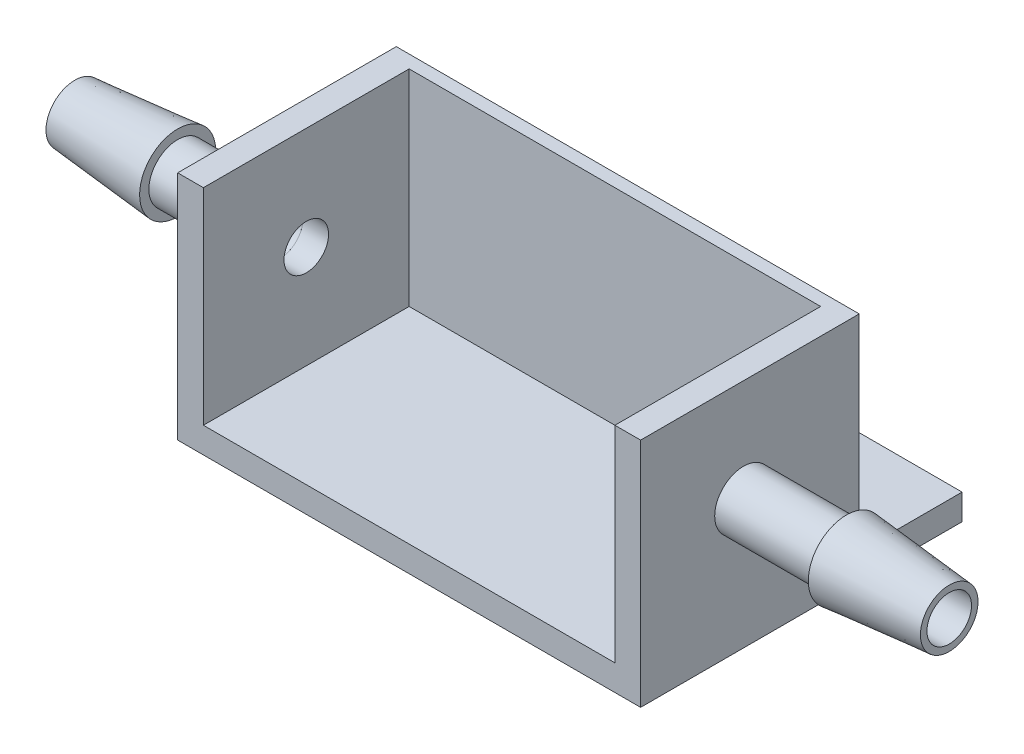
ISO-10303-21;
HEADER;
FILE_DESCRIPTION(('STEP AP214'),'2;1');
FILE_NAME('part.step','',(''),(''),'','','');
FILE_SCHEMA(('AUTOMOTIVE_DESIGN { 1 0 10303 214 1 1 1 1 }'));
ENDSEC;
DATA;
#1=APPLICATION_CONTEXT('core data for automotive mechanical design processes');
#2=APPLICATION_PROTOCOL_DEFINITION('international standard','automotive_design',2000,#1);
#3=PRODUCT_CONTEXT('',#1,'mechanical');
#4=PRODUCT('Part','Part','',(#3));
#5=PRODUCT_RELATED_PRODUCT_CATEGORY('part','',(#4));
#6=PRODUCT_DEFINITION_FORMATION('','',#4);
#7=PRODUCT_DEFINITION_CONTEXT('part definition',#1,'design');
#8=PRODUCT_DEFINITION('design','',#6,#7);
#9=PRODUCT_DEFINITION_SHAPE('','',#8);
#10=(LENGTH_UNIT() NAMED_UNIT(*) SI_UNIT(.MILLI.,.METRE.));
#11=(NAMED_UNIT(*) PLANE_ANGLE_UNIT() SI_UNIT($,.RADIAN.));
#12=(NAMED_UNIT(*) SI_UNIT($,.STERADIAN.) SOLID_ANGLE_UNIT());
#13=UNCERTAINTY_MEASURE_WITH_UNIT(LENGTH_MEASURE(1.E-05),#10,'distance_accuracy_value','');
#14=(GEOMETRIC_REPRESENTATION_CONTEXT(3) GLOBAL_UNCERTAINTY_ASSIGNED_CONTEXT((#13)) GLOBAL_UNIT_ASSIGNED_CONTEXT((#10,
#11,#12)) REPRESENTATION_CONTEXT('',''));
#15=CARTESIAN_POINT('',(0.,0.,0.));
#16=DIRECTION('',(0.,0.,1.));
#17=DIRECTION('',(1.,0.,0.));
#18=AXIS2_PLACEMENT_3D('',#15,#16,#17);
#19=CARTESIAN_POINT('',(57.15,35.687,0.));
#20=DIRECTION('',(1.,0.,0.));
#21=DIRECTION('',(0.,0.,-1.));
#22=AXIS2_PLACEMENT_3D('',#19,#20,#21);
#23=PLANE('',#22);
#24=CARTESIAN_POINT('',(57.15,31.75,0.));
#25=DIRECTION('',(1.,0.,0.));
#26=DIRECTION('',(0.,0.,-1.));
#27=AXIS2_PLACEMENT_3D('',#24,#25,#26);
#28=CIRCLE('',#27,5.5);
#29=CARTESIAN_POINT('',(57.15,31.75,-5.5));
#30=VERTEX_POINT('',#29);
#31=EDGE_CURVE('E61',#30,#30,#28,.T.);
#32=ORIENTED_EDGE('',*,*,#31,.T.);
#33=EDGE_LOOP('',(#32));
#34=FACE_BOUND('',#33,.T.);
#35=CARTESIAN_POINT('',(57.15,31.75,0.));
#36=DIRECTION('',(-1.,0.,0.));
#37=DIRECTION('',(0.,0.,1.));
#38=AXIS2_PLACEMENT_3D('',#35,#36,#37);
#39=CIRCLE('',#38,7.11200000000003);
#40=CARTESIAN_POINT('',(57.15,31.75,7.11200000000003));
#41=VERTEX_POINT('',#40);
#42=EDGE_CURVE('E11',#41,#41,#39,.T.);
#43=ORIENTED_EDGE('',*,*,#42,.T.);
#44=EDGE_LOOP('',(#43));
#45=FACE_BOUND('',#44,.T.);
#46=ADVANCED_FACE('F42',(#34,#45),#23,.F.);
#47=CARTESIAN_POINT('',(-76.2,31.75,0.));
#48=DIRECTION('',(-1.,0.,0.));
#49=DIRECTION('',(0.,0.,1.));
#50=AXIS2_PLACEMENT_3D('',#47,#48,#49);
#51=CYLINDRICAL_SURFACE('',#50,7.11200000000003);
#52=ORIENTED_EDGE('',*,*,#42,.F.);
#53=EDGE_LOOP('',(#52));
#54=FACE_BOUND('',#53,.T.);
#55=CARTESIAN_POINT('',(82.55,31.75,0.));
#56=DIRECTION('',(-1.,0.,0.));
#57=DIRECTION('',(0.,0.,1.));
#58=AXIS2_PLACEMENT_3D('',#55,#56,#57);
#59=CIRCLE('',#58,7.11200000000003);
#60=CARTESIAN_POINT('',(82.55,31.75,7.11200000000003));
#61=VERTEX_POINT('',#60);
#62=EDGE_CURVE('E48',#61,#61,#59,.T.);
#63=ORIENTED_EDGE('',*,*,#62,.T.);
#64=EDGE_LOOP('',(#63));
#65=FACE_BOUND('',#64,.T.);
#66=ADVANCED_FACE('F85',(#54,#65),#51,.T.);
#67=CARTESIAN_POINT('',(82.55,38.862,0.));
#68=DIRECTION('',(1.,0.,0.));
#69=DIRECTION('',(0.,0.,-1.));
#70=AXIS2_PLACEMENT_3D('',#67,#68,#69);
#71=PLANE('',#70);
#72=ORIENTED_EDGE('',*,*,#62,.F.);
#73=EDGE_LOOP('',(#72));
#74=FACE_BOUND('',#73,.T.);
#75=CARTESIAN_POINT('',(82.55,31.75,0.));
#76=DIRECTION('',(-1.,0.,0.));
#77=DIRECTION('',(0.,0.,1.));
#78=AXIS2_PLACEMENT_3D('',#75,#76,#77);
#79=CIRCLE('',#78,9.39800000000002);
#80=CARTESIAN_POINT('',(82.55,31.75,9.39800000000002));
#81=VERTEX_POINT('',#80);
#82=EDGE_CURVE('E52',#81,#81,#79,.T.);
#83=ORIENTED_EDGE('',*,*,#82,.T.);
#84=EDGE_LOOP('',(#83));
#85=FACE_BOUND('',#84,.T.);
#86=ADVANCED_FACE('F79',(#74,#85),#71,.F.);
#87=CARTESIAN_POINT('',(107.95,31.75,0.));
#88=DIRECTION('',(-1.,0.,0.));
#89=DIRECTION('',(0.,0.,1.));
#90=AXIS2_PLACEMENT_3D('',#87,#88,#89);
#91=CONICAL_SURFACE('',#90,7.11200000000004,0.0897581741899497);
#92=ORIENTED_EDGE('',*,*,#82,.F.);
#93=EDGE_LOOP('',(#92));
#94=FACE_BOUND('',#93,.T.);
#95=CARTESIAN_POINT('',(107.95,31.75,0.));
#96=DIRECTION('',(-1.,0.,0.));
#97=DIRECTION('',(0.,0.,1.));
#98=AXIS2_PLACEMENT_3D('',#95,#96,#97);
#99=CIRCLE('',#98,7.11200000000004);
#100=CARTESIAN_POINT('',(107.95,31.75,7.11200000000004));
#101=VERTEX_POINT('',#100);
#102=EDGE_CURVE('E56',#101,#101,#99,.T.);
#103=ORIENTED_EDGE('',*,*,#102,.T.);
#104=EDGE_LOOP('',(#103));
#105=FACE_BOUND('',#104,.T.);
#106=ADVANCED_FACE('F74',(#94,#105),#91,.T.);
#107=CARTESIAN_POINT('',(107.95,38.862,0.));
#108=DIRECTION('',(-1.,0.,0.));
#109=DIRECTION('',(0.,0.,1.));
#110=AXIS2_PLACEMENT_3D('',#107,#108,#109);
#111=PLANE('',#110);
#112=CARTESIAN_POINT('',(107.95,31.75,0.));
#113=DIRECTION('',(1.,0.,0.));
#114=DIRECTION('',(0.,0.,-1.));
#115=AXIS2_PLACEMENT_3D('',#112,#113,#114);
#116=CIRCLE('',#115,5.5);
#117=CARTESIAN_POINT('',(107.95,31.75,-5.5));
#118=VERTEX_POINT('',#117);
#119=EDGE_CURVE('E64',#118,#118,#116,.T.);
#120=ORIENTED_EDGE('',*,*,#119,.F.);
#121=EDGE_LOOP('',(#120));
#122=FACE_BOUND('',#121,.T.);
#123=ORIENTED_EDGE('',*,*,#102,.F.);
#124=EDGE_LOOP('',(#123));
#125=FACE_BOUND('',#124,.T.);
#126=ADVANCED_FACE('F71',(#122,#125),#111,.F.);
#127=CARTESIAN_POINT('',(-107.95,31.75,0.));
#128=DIRECTION('',(1.,0.,0.));
#129=DIRECTION('',(0.,0.,-1.));
#130=AXIS2_PLACEMENT_3D('',#127,#128,#129);
#131=CYLINDRICAL_SURFACE('',#130,5.5);
#132=ORIENTED_EDGE('',*,*,#119,.T.);
#133=EDGE_LOOP('',(#132));
#134=FACE_BOUND('',#133,.T.);
#135=ORIENTED_EDGE('',*,*,#31,.F.);
#136=EDGE_LOOP('',(#135));
#137=FACE_BOUND('',#136,.T.);
#138=ADVANCED_FACE('F68',(#134,#137),#131,.F.);
#139=CLOSED_SHELL('',(#46,#66,#86,#106,#126,#138));
#140=MANIFOLD_SOLID_BREP('B2',#139);
#141=CARTESIAN_POINT('',(-76.2,31.75,0.));
#142=DIRECTION('',(-1.,0.,0.));
#143=DIRECTION('',(0.,0.,1.));
#144=AXIS2_PLACEMENT_3D('',#141,#142,#143);
#145=CYLINDRICAL_SURFACE('',#144,7.11200000000001);
#146=CARTESIAN_POINT('',(-82.55,31.75,0.));
#147=DIRECTION('',(-1.,0.,0.));
#148=DIRECTION('',(0.,0.,1.));
#149=AXIS2_PLACEMENT_3D('',#146,#147,#148);
#150=CIRCLE('',#149,7.11200000000001);
#151=CARTESIAN_POINT('',(-82.55,31.75,7.11200000000001));
#152=VERTEX_POINT('',#151);
#153=EDGE_CURVE('E150',#152,#152,#150,.T.);
#154=ORIENTED_EDGE('',*,*,#153,.F.);
#155=EDGE_LOOP('',(#154));
#156=FACE_BOUND('',#155,.T.);
#157=CARTESIAN_POINT('',(-57.15,31.75,0.));
#158=DIRECTION('',(-1.,0.,0.));
#159=DIRECTION('',(0.,0.,1.));
#160=AXIS2_PLACEMENT_3D('',#157,#158,#159);
#161=CIRCLE('',#160,7.11200000000001);
#162=CARTESIAN_POINT('',(-57.15,31.75,7.11200000000001));
#163=VERTEX_POINT('',#162);
#164=EDGE_CURVE('E41',#163,#163,#161,.T.);
#165=ORIENTED_EDGE('',*,*,#164,.T.);
#166=EDGE_LOOP('',(#165));
#167=FACE_BOUND('',#166,.T.);
#168=ADVANCED_FACE('F143',(#156,#167),#145,.T.);
#169=CARTESIAN_POINT('',(-82.55,38.862,0.));
#170=DIRECTION('',(-1.,0.,0.));
#171=DIRECTION('',(0.,0.,1.));
#172=AXIS2_PLACEMENT_3D('',#169,#170,#171);
#173=PLANE('',#172);
#174=CARTESIAN_POINT('',(-82.55,31.75,0.));
#175=DIRECTION('',(-1.,0.,0.));
#176=DIRECTION('',(0.,0.,1.));
#177=AXIS2_PLACEMENT_3D('',#174,#175,#176);
#178=CIRCLE('',#177,9.398);
#179=CARTESIAN_POINT('',(-82.55,31.75,9.398));
#180=VERTEX_POINT('',#179);
#181=EDGE_CURVE('E154',#180,#180,#178,.T.);
#182=ORIENTED_EDGE('',*,*,#181,.F.);
#183=EDGE_LOOP('',(#182));
#184=FACE_BOUND('',#183,.T.);
#185=ORIENTED_EDGE('',*,*,#153,.T.);
#186=EDGE_LOOP('',(#185));
#187=FACE_BOUND('',#186,.T.);
#188=ADVANCED_FACE('F182',(#184,#187),#173,.F.);
#189=CARTESIAN_POINT('',(-82.55,31.75,0.));
#190=DIRECTION('',(1.,0.,0.));
#191=DIRECTION('',(0.,0.,-1.));
#192=AXIS2_PLACEMENT_3D('',#189,#190,#191);
#193=CONICAL_SURFACE('',#192,9.398,0.0897581741899501);
#194=CARTESIAN_POINT('',(-107.95,31.75,0.));
#195=DIRECTION('',(-1.,0.,0.));
#196=DIRECTION('',(0.,0.,1.));
#197=AXIS2_PLACEMENT_3D('',#194,#195,#196);
#198=CIRCLE('',#197,7.11200000000001);
#199=CARTESIAN_POINT('',(-107.95,31.75,7.11200000000001));
#200=VERTEX_POINT('',#199);
#201=EDGE_CURVE('E159',#200,#200,#198,.T.);
#202=ORIENTED_EDGE('',*,*,#201,.F.);
#203=EDGE_LOOP('',(#202));
#204=FACE_BOUND('',#203,.T.);
#205=ORIENTED_EDGE('',*,*,#181,.T.);
#206=EDGE_LOOP('',(#205));
#207=FACE_BOUND('',#206,.T.);
#208=ADVANCED_FACE('F187',(#204,#207),#193,.T.);
#209=CARTESIAN_POINT('',(-107.95,35.687,0.));
#210=DIRECTION('',(1.,0.,0.));
#211=DIRECTION('',(0.,0.,-1.));
#212=AXIS2_PLACEMENT_3D('',#209,#210,#211);
#213=PLANE('',#212);
#214=CARTESIAN_POINT('',(-107.95,31.75,0.));
#215=DIRECTION('',(1.,0.,0.));
#216=DIRECTION('',(0.,0.,-1.));
#217=AXIS2_PLACEMENT_3D('',#214,#215,#216);
#218=CIRCLE('',#217,5.5);
#219=CARTESIAN_POINT('',(-107.95,31.75,-5.5));
#220=VERTEX_POINT('',#219);
#221=EDGE_CURVE('E162',#220,#220,#218,.T.);
#222=ORIENTED_EDGE('',*,*,#221,.T.);
#223=EDGE_LOOP('',(#222));
#224=FACE_BOUND('',#223,.T.);
#225=ORIENTED_EDGE('',*,*,#201,.T.);
#226=EDGE_LOOP('',(#225));
#227=FACE_BOUND('',#226,.T.);
#228=ADVANCED_FACE('F179',(#224,#227),#213,.F.);
#229=CARTESIAN_POINT('',(-57.15,31.75,0.));
#230=DIRECTION('',(-1.,0.,0.));
#231=DIRECTION('',(0.,0.,1.));
#232=AXIS2_PLACEMENT_3D('',#229,#230,#231);
#233=PLANE('',#232);
#234=CARTESIAN_POINT('',(-57.15,31.75,0.));
#235=DIRECTION('',(-1.,0.,0.));
#236=DIRECTION('',(0.,0.,1.));
#237=AXIS2_PLACEMENT_3D('',#234,#235,#236);
#238=CIRCLE('',#237,5.5);
#239=CARTESIAN_POINT('',(-57.15,31.75,5.5));
#240=VERTEX_POINT('',#239);
#241=EDGE_CURVE('E146',#240,#240,#238,.T.);
#242=ORIENTED_EDGE('',*,*,#241,.T.);
#243=EDGE_LOOP('',(#242));
#244=FACE_BOUND('',#243,.T.);
#245=ORIENTED_EDGE('',*,*,#164,.F.);
#246=EDGE_LOOP('',(#245));
#247=FACE_BOUND('',#246,.T.);
#248=ADVANCED_FACE('F169',(#244,#247),#233,.F.);
#249=CARTESIAN_POINT('',(-107.95,31.75,0.));
#250=DIRECTION('',(1.,0.,0.));
#251=DIRECTION('',(0.,0.,-1.));
#252=AXIS2_PLACEMENT_3D('',#249,#250,#251);
#253=CYLINDRICAL_SURFACE('',#252,5.5);
#254=ORIENTED_EDGE('',*,*,#221,.F.);
#255=EDGE_LOOP('',(#254));
#256=FACE_BOUND('',#255,.T.);
#257=ORIENTED_EDGE('',*,*,#241,.F.);
#258=EDGE_LOOP('',(#257));
#259=FACE_BOUND('',#258,.T.);
#260=ADVANCED_FACE('F172',(#256,#259),#253,.F.);
#261=CLOSED_SHELL('',(#168,#188,#208,#228,#248,#260));
#262=MANIFOLD_SOLID_BREP('B6',#261);
#263=CARTESIAN_POINT('',(0.,0.,-28.575));
#264=DIRECTION('',(0.,0.,-1.));
#265=DIRECTION('',(-1.,0.,0.));
#266=AXIS2_PLACEMENT_3D('',#263,#264,#265);
#267=PLANE('',#266);
#268=DIRECTION('',(0.,-1.,0.));
#269=VECTOR('',#268,1.);
#270=CARTESIAN_POINT('',(57.15,57.15,-28.575));
#271=LINE('',#270,#269);
#272=CARTESIAN_POINT('',(57.15,57.15,-28.575));
#273=VERTEX_POINT('',#272);
#274=CARTESIAN_POINT('',(57.15,6.35,-28.575));
#275=VERTEX_POINT('',#274);
#276=EDGE_CURVE('E400',#273,#275,#271,.T.);
#277=ORIENTED_EDGE('',*,*,#276,.T.);
#278=DIRECTION('',(-1.,0.,0.));
#279=VECTOR('',#278,1.);
#280=CARTESIAN_POINT('',(-57.15,6.35,-28.575));
#281=LINE('',#280,#279);
#282=CARTESIAN_POINT('',(-57.15,6.35,-28.575));
#283=VERTEX_POINT('',#282);
#284=EDGE_CURVE('E386',#275,#283,#281,.T.);
#285=ORIENTED_EDGE('',*,*,#284,.T.);
#286=DIRECTION('',(0.,1.,0.));
#287=VECTOR('',#286,1.);
#288=CARTESIAN_POINT('',(-57.15,57.15,-28.575));
#289=LINE('',#288,#287);
#290=CARTESIAN_POINT('',(-57.15,57.15,-28.575));
#291=VERTEX_POINT('',#290);
#292=EDGE_CURVE('E403',#283,#291,#289,.T.);
#293=ORIENTED_EDGE('',*,*,#292,.T.);
#294=DIRECTION('',(1.,0.,0.));
#295=VECTOR('',#294,1.);
#296=CARTESIAN_POINT('',(57.15,57.15,-28.575));
#297=LINE('',#296,#295);
#298=EDGE_CURVE('E337',#291,#273,#297,.T.);
#299=ORIENTED_EDGE('',*,*,#298,.T.);
#300=EDGE_LOOP('',(#277,#285,#293,#299));
#301=FACE_BOUND('',#300,.T.);
#302=ADVANCED_FACE('F241',(#301),#267,.T.);
#303=CARTESIAN_POINT('',(-57.15,0.,25.4));
#304=DIRECTION('',(0.,1.,0.));
#305=DIRECTION('',(0.,0.,1.));
#306=AXIS2_PLACEMENT_3D('',#303,#304,#305);
#307=PLANE('',#306);
#308=DIRECTION('',(0.,0.,-1.));
#309=VECTOR('',#308,1.);
#310=CARTESIAN_POINT('',(-57.15,0.,25.4));
#311=LINE('',#310,#309);
#312=CARTESIAN_POINT('',(-57.15,0.,25.4));
#313=VERTEX_POINT('',#312);
#314=CARTESIAN_POINT('',(-57.15,0.,-53.975));
#315=VERTEX_POINT('',#314);
#316=EDGE_CURVE('E141',#313,#315,#311,.T.);
#317=ORIENTED_EDGE('',*,*,#316,.T.);
#318=DIRECTION('',(1.,0.,0.));
#319=VECTOR('',#318,1.);
#320=CARTESIAN_POINT('',(-57.15,0.,-53.975));
#321=LINE('',#320,#319);
#322=CARTESIAN_POINT('',(57.15,0.,-53.975));
#323=VERTEX_POINT('',#322);
#324=EDGE_CURVE('E373',#315,#323,#321,.T.);
#325=ORIENTED_EDGE('',*,*,#324,.T.);
#326=DIRECTION('',(0.,0.,-1.));
#327=VECTOR('',#326,1.);
#328=CARTESIAN_POINT('',(57.15,0.,25.4));
#329=LINE('',#328,#327);
#330=CARTESIAN_POINT('',(57.15,0.,25.4));
#331=VERTEX_POINT('',#330);
#332=EDGE_CURVE('E250',#331,#323,#329,.T.);
#333=ORIENTED_EDGE('',*,*,#332,.F.);
#334=DIRECTION('',(1.,0.,0.));
#335=VECTOR('',#334,1.);
#336=CARTESIAN_POINT('',(-57.15,0.,25.4));
#337=LINE('',#336,#335);
#338=EDGE_CURVE('E411',#313,#331,#337,.T.);
#339=ORIENTED_EDGE('',*,*,#338,.F.);
#340=EDGE_LOOP('',(#317,#325,#333,#339));
#341=FACE_BOUND('',#340,.T.);
#342=CARTESIAN_POINT('',(-38.1,0.,-41.275));
#343=DIRECTION('',(0.,-1.,0.));
#344=DIRECTION('',(0.,0.,-1.));
#345=AXIS2_PLACEMENT_3D('',#342,#343,#344);
#346=CIRCLE('',#345,3.429);
#347=CARTESIAN_POINT('',(-38.1,0.,-44.704));
#348=VERTEX_POINT('',#347);
#349=EDGE_CURVE('E448',#348,#348,#346,.T.);
#350=ORIENTED_EDGE('',*,*,#349,.F.);
#351=EDGE_LOOP('',(#350));
#352=FACE_BOUND('',#351,.T.);
#353=CARTESIAN_POINT('',(-12.7,0.,-41.275));
#354=DIRECTION('',(0.,-1.,0.));
#355=DIRECTION('',(0.,0.,-1.));
#356=AXIS2_PLACEMENT_3D('',#353,#354,#355);
#357=CIRCLE('',#356,3.429);
#358=CARTESIAN_POINT('',(-12.7,0.,-44.704));
#359=VERTEX_POINT('',#358);
#360=EDGE_CURVE('E442',#359,#359,#357,.T.);
#361=ORIENTED_EDGE('',*,*,#360,.F.);
#362=EDGE_LOOP('',(#361));
#363=FACE_BOUND('',#362,.T.);
#364=CARTESIAN_POINT('',(12.7,0.,-41.275));
#365=DIRECTION('',(0.,-1.,0.));
#366=DIRECTION('',(0.,0.,-1.));
#367=AXIS2_PLACEMENT_3D('',#364,#365,#366);
#368=CIRCLE('',#367,3.429);
#369=CARTESIAN_POINT('',(12.7,0.,-44.704));
#370=VERTEX_POINT('',#369);
#371=EDGE_CURVE('E436',#370,#370,#368,.T.);
#372=ORIENTED_EDGE('',*,*,#371,.F.);
#373=EDGE_LOOP('',(#372));
#374=FACE_BOUND('',#373,.T.);
#375=CARTESIAN_POINT('',(38.1,0.,-41.275));
#376=DIRECTION('',(0.,-1.,0.));
#377=DIRECTION('',(0.,0.,-1.));
#378=AXIS2_PLACEMENT_3D('',#375,#376,#377);
#379=CIRCLE('',#378,3.429);
#380=CARTESIAN_POINT('',(38.1,0.,-44.704));
#381=VERTEX_POINT('',#380);
#382=EDGE_CURVE('E383',#381,#381,#379,.T.);
#383=ORIENTED_EDGE('',*,*,#382,.F.);
#384=EDGE_LOOP('',(#383));
#385=FACE_BOUND('',#384,.T.);
#386=ADVANCED_FACE('F243',(#341,#352,#363,#374,#385),#307,.F.);
#387=CARTESIAN_POINT('',(57.15,6.35,25.4));
#388=DIRECTION('',(-1.,0.,0.));
#389=DIRECTION('',(0.,0.,1.));
#390=AXIS2_PLACEMENT_3D('',#387,#388,#389);
#391=PLANE('',#390);
#392=CARTESIAN_POINT('',(57.15,31.75,0.));
#393=DIRECTION('',(-1.,0.,0.));
#394=DIRECTION('',(0.,0.,1.));
#395=AXIS2_PLACEMENT_3D('',#392,#393,#394);
#396=CIRCLE('',#395,5.5);
#397=CARTESIAN_POINT('',(57.15,31.75,5.5));
#398=VERTEX_POINT('',#397);
#399=EDGE_CURVE('E396',#398,#398,#396,.T.);
#400=ORIENTED_EDGE('',*,*,#399,.T.);
#401=EDGE_LOOP('',(#400));
#402=FACE_BOUND('',#401,.T.);
#403=ORIENTED_EDGE('',*,*,#332,.T.);
#404=DIRECTION('',(0.,-1.,0.));
#405=VECTOR('',#404,1.);
#406=CARTESIAN_POINT('',(57.15,6.35,-53.975));
#407=LINE('',#406,#405);
#408=CARTESIAN_POINT('',(57.15,6.35,-53.975));
#409=VERTEX_POINT('',#408);
#410=EDGE_CURVE('E359',#409,#323,#407,.T.);
#411=ORIENTED_EDGE('',*,*,#410,.F.);
#412=DIRECTION('',(0.,0.,1.));
#413=VECTOR('',#412,1.);
#414=CARTESIAN_POINT('',(57.15,6.35,-28.575));
#415=LINE('',#414,#413);
#416=EDGE_CURVE('E430',#409,#275,#415,.T.);
#417=ORIENTED_EDGE('',*,*,#416,.T.);
#418=ORIENTED_EDGE('',*,*,#276,.F.);
#419=DIRECTION('',(0.,0.,-1.));
#420=VECTOR('',#419,1.);
#421=CARTESIAN_POINT('',(57.15,57.15,25.4));
#422=LINE('',#421,#420);
#423=CARTESIAN_POINT('',(57.15,57.15,25.4));
#424=VERTEX_POINT('',#423);
#425=EDGE_CURVE('E346',#424,#273,#422,.T.);
#426=ORIENTED_EDGE('',*,*,#425,.F.);
#427=DIRECTION('',(0.,1.,0.));
#428=VECTOR('',#427,1.);
#429=CARTESIAN_POINT('',(57.15,0.,25.4));
#430=LINE('',#429,#428);
#431=EDGE_CURVE('E362',#331,#424,#430,.T.);
#432=ORIENTED_EDGE('',*,*,#431,.F.);
#433=EDGE_LOOP('',(#403,#411,#417,#418,#426,#432));
#434=FACE_BOUND('',#433,.T.);
#435=ADVANCED_FACE('F356',(#402,#434),#391,.F.);
#436=CARTESIAN_POINT('',(50.8,6.35,25.4));
#437=DIRECTION('',(1.,0.,0.));
#438=DIRECTION('',(0.,0.,-1.));
#439=AXIS2_PLACEMENT_3D('',#436,#437,#438);
#440=PLANE('',#439);
#441=CARTESIAN_POINT('',(50.8,31.75,0.));
#442=DIRECTION('',(1.,0.,0.));
#443=DIRECTION('',(0.,0.,-1.));
#444=AXIS2_PLACEMENT_3D('',#441,#442,#443);
#445=CIRCLE('',#444,5.5);
#446=CARTESIAN_POINT('',(50.8,31.75,-5.5));
#447=VERTEX_POINT('',#446);
#448=EDGE_CURVE('E393',#447,#447,#445,.T.);
#449=ORIENTED_EDGE('',*,*,#448,.T.);
#450=EDGE_LOOP('',(#449));
#451=FACE_BOUND('',#450,.T.);
#452=DIRECTION('',(0.,-1.,0.));
#453=VECTOR('',#452,1.);
#454=CARTESIAN_POINT('',(50.8,6.35,-25.4));
#455=LINE('',#454,#453);
#456=CARTESIAN_POINT('',(50.8,57.15,-25.4));
#457=VERTEX_POINT('',#456);
#458=CARTESIAN_POINT('',(50.8,6.35,-25.4));
#459=VERTEX_POINT('',#458);
#460=EDGE_CURVE('E335',#457,#459,#455,.T.);
#461=ORIENTED_EDGE('',*,*,#460,.T.);
#462=DIRECTION('',(0.,0.,-1.));
#463=VECTOR('',#462,1.);
#464=CARTESIAN_POINT('',(50.8,6.35,25.4));
#465=LINE('',#464,#463);
#466=CARTESIAN_POINT('',(50.8,6.35,25.4));
#467=VERTEX_POINT('',#466);
#468=EDGE_CURVE('E323',#467,#459,#465,.T.);
#469=ORIENTED_EDGE('',*,*,#468,.F.);
#470=DIRECTION('',(0.,-1.,0.));
#471=VECTOR('',#470,1.);
#472=CARTESIAN_POINT('',(50.8,6.35,25.4));
#473=LINE('',#472,#471);
#474=CARTESIAN_POINT('',(50.8,57.15,25.4));
#475=VERTEX_POINT('',#474);
#476=EDGE_CURVE('E314',#475,#467,#473,.T.);
#477=ORIENTED_EDGE('',*,*,#476,.F.);
#478=DIRECTION('',(0.,0.,-1.));
#479=VECTOR('',#478,1.);
#480=CARTESIAN_POINT('',(50.8,57.15,25.4));
#481=LINE('',#480,#479);
#482=EDGE_CURVE('E343',#475,#457,#481,.T.);
#483=ORIENTED_EDGE('',*,*,#482,.T.);
#484=EDGE_LOOP('',(#461,#469,#477,#483));
#485=FACE_BOUND('',#484,.T.);
#486=ADVANCED_FACE('F420',(#451,#485),#440,.F.);
#487=CARTESIAN_POINT('',(-50.8,6.35,25.4));
#488=DIRECTION('',(0.,-1.,0.));
#489=DIRECTION('',(0.,0.,-1.));
#490=AXIS2_PLACEMENT_3D('',#487,#488,#489);
#491=PLANE('',#490);
#492=DIRECTION('',(-1.,0.,0.));
#493=VECTOR('',#492,1.);
#494=CARTESIAN_POINT('',(-50.8,6.35,-25.4));
#495=LINE('',#494,#493);
#496=CARTESIAN_POINT('',(-50.8,6.35,-25.4));
#497=VERTEX_POINT('',#496);
#498=EDGE_CURVE('E280',#459,#497,#495,.T.);
#499=ORIENTED_EDGE('',*,*,#498,.T.);
#500=DIRECTION('',(0.,0.,-1.));
#501=VECTOR('',#500,1.);
#502=CARTESIAN_POINT('',(-50.8,6.35,25.4));
#503=LINE('',#502,#501);
#504=CARTESIAN_POINT('',(-50.8,6.35,25.4));
#505=VERTEX_POINT('',#504);
#506=EDGE_CURVE('E320',#505,#497,#503,.T.);
#507=ORIENTED_EDGE('',*,*,#506,.F.);
#508=DIRECTION('',(-1.,0.,0.));
#509=VECTOR('',#508,1.);
#510=CARTESIAN_POINT('',(-50.8,6.35,25.4));
#511=LINE('',#510,#509);
#512=EDGE_CURVE('E307',#467,#505,#511,.T.);
#513=ORIENTED_EDGE('',*,*,#512,.F.);
#514=ORIENTED_EDGE('',*,*,#468,.T.);
#515=EDGE_LOOP('',(#499,#507,#513,#514));
#516=FACE_BOUND('',#515,.T.);
#517=ADVANCED_FACE('F321',(#516),#491,.F.);
#518=CARTESIAN_POINT('',(-50.8,6.35,25.4));
#519=DIRECTION('',(-1.,0.,0.));
#520=DIRECTION('',(0.,0.,1.));
#521=AXIS2_PLACEMENT_3D('',#518,#519,#520);
#522=PLANE('',#521);
#523=CARTESIAN_POINT('',(-50.8,31.75,0.));
#524=DIRECTION('',(-1.,0.,0.));
#525=DIRECTION('',(0.,0.,1.));
#526=AXIS2_PLACEMENT_3D('',#523,#524,#525);
#527=CIRCLE('',#526,5.5);
#528=CARTESIAN_POINT('',(-50.8,31.75,5.5));
#529=VERTEX_POINT('',#528);
#530=EDGE_CURVE('E390',#529,#529,#527,.T.);
#531=ORIENTED_EDGE('',*,*,#530,.T.);
#532=EDGE_LOOP('',(#531));
#533=FACE_BOUND('',#532,.T.);
#534=DIRECTION('',(0.,1.,0.));
#535=VECTOR('',#534,1.);
#536=CARTESIAN_POINT('',(-50.8,6.35,-25.4));
#537=LINE('',#536,#535);
#538=CARTESIAN_POINT('',(-50.8,57.15,-25.4));
#539=VERTEX_POINT('',#538);
#540=EDGE_CURVE('E289',#497,#539,#537,.T.);
#541=ORIENTED_EDGE('',*,*,#540,.T.);
#542=DIRECTION('',(0.,0.,-1.));
#543=VECTOR('',#542,1.);
#544=CARTESIAN_POINT('',(-50.8,57.15,25.4));
#545=LINE('',#544,#543);
#546=CARTESIAN_POINT('',(-50.8,57.15,25.4));
#547=VERTEX_POINT('',#546);
#548=EDGE_CURVE('E324',#547,#539,#545,.T.);
#549=ORIENTED_EDGE('',*,*,#548,.F.);
#550=DIRECTION('',(0.,1.,0.));
#551=VECTOR('',#550,1.);
#552=CARTESIAN_POINT('',(-50.8,6.35,25.4));
#553=LINE('',#552,#551);
#554=EDGE_CURVE('E311',#505,#547,#553,.T.);
#555=ORIENTED_EDGE('',*,*,#554,.F.);
#556=ORIENTED_EDGE('',*,*,#506,.T.);
#557=EDGE_LOOP('',(#541,#549,#555,#556));
#558=FACE_BOUND('',#557,.T.);
#559=ADVANCED_FACE('F326',(#533,#558),#522,.F.);
#560=CARTESIAN_POINT('',(-57.15,57.15,25.4));
#561=DIRECTION('',(0.,-1.,0.));
#562=DIRECTION('',(0.,0.,-1.));
#563=AXIS2_PLACEMENT_3D('',#560,#561,#562);
#564=PLANE('',#563);
#565=ORIENTED_EDGE('',*,*,#548,.T.);
#566=DIRECTION('',(1.,0.,0.));
#567=VECTOR('',#566,1.);
#568=CARTESIAN_POINT('',(57.15,57.15,-25.4));
#569=LINE('',#568,#567);
#570=EDGE_CURVE('E399',#539,#457,#569,.T.);
#571=ORIENTED_EDGE('',*,*,#570,.T.);
#572=ORIENTED_EDGE('',*,*,#482,.F.);
#573=DIRECTION('',(-1.,0.,0.));
#574=VECTOR('',#573,1.);
#575=CARTESIAN_POINT('',(57.15,57.15,25.4));
#576=LINE('',#575,#574);
#577=EDGE_CURVE('E414',#424,#475,#576,.T.);
#578=ORIENTED_EDGE('',*,*,#577,.F.);
#579=ORIENTED_EDGE('',*,*,#425,.T.);
#580=ORIENTED_EDGE('',*,*,#298,.F.);
#581=DIRECTION('',(0.,0.,-1.));
#582=VECTOR('',#581,1.);
#583=CARTESIAN_POINT('',(-57.15,57.15,25.4));
#584=LINE('',#583,#582);
#585=CARTESIAN_POINT('',(-57.15,57.15,25.4));
#586=VERTEX_POINT('',#585);
#587=EDGE_CURVE('E331',#586,#291,#584,.T.);
#588=ORIENTED_EDGE('',*,*,#587,.F.);
#589=DIRECTION('',(-1.,0.,0.));
#590=VECTOR('',#589,1.);
#591=CARTESIAN_POINT('',(-57.15,57.15,25.4));
#592=LINE('',#591,#590);
#593=EDGE_CURVE('E329',#547,#586,#592,.T.);
#594=ORIENTED_EDGE('',*,*,#593,.F.);
#595=EDGE_LOOP('',(#565,#571,#572,#578,#579,#580,#588,#594));
#596=FACE_BOUND('',#595,.T.);
#597=ADVANCED_FACE('F418',(#596),#564,.F.);
#598=CARTESIAN_POINT('',(-57.15,6.35,25.4));
#599=DIRECTION('',(1.,0.,0.));
#600=DIRECTION('',(0.,0.,-1.));
#601=AXIS2_PLACEMENT_3D('',#598,#599,#600);
#602=PLANE('',#601);
#603=CARTESIAN_POINT('',(-57.15,31.75,0.));
#604=DIRECTION('',(1.,0.,0.));
#605=DIRECTION('',(0.,0.,-1.));
#606=AXIS2_PLACEMENT_3D('',#603,#604,#605);
#607=CIRCLE('',#606,5.5);
#608=CARTESIAN_POINT('',(-57.15,31.75,-5.5));
#609=VERTEX_POINT('',#608);
#610=EDGE_CURVE('E245',#609,#609,#607,.T.);
#611=ORIENTED_EDGE('',*,*,#610,.T.);
#612=EDGE_LOOP('',(#611));
#613=FACE_BOUND('',#612,.T.);
#614=ORIENTED_EDGE('',*,*,#587,.T.);
#615=ORIENTED_EDGE('',*,*,#292,.F.);
#616=DIRECTION('',(0.,0.,-1.));
#617=VECTOR('',#616,1.);
#618=CARTESIAN_POINT('',(-57.15,6.35,-28.575));
#619=LINE('',#618,#617);
#620=CARTESIAN_POINT('',(-57.15,6.35,-53.975));
#621=VERTEX_POINT('',#620);
#622=EDGE_CURVE('E257',#283,#621,#619,.T.);
#623=ORIENTED_EDGE('',*,*,#622,.T.);
#624=DIRECTION('',(0.,-1.,0.));
#625=VECTOR('',#624,1.);
#626=CARTESIAN_POINT('',(-57.15,6.35,-53.975));
#627=LINE('',#626,#625);
#628=EDGE_CURVE('E375',#621,#315,#627,.T.);
#629=ORIENTED_EDGE('',*,*,#628,.T.);
#630=ORIENTED_EDGE('',*,*,#316,.F.);
#631=DIRECTION('',(0.,-1.,0.));
#632=VECTOR('',#631,1.);
#633=CARTESIAN_POINT('',(-57.15,0.,25.4));
#634=LINE('',#633,#632);
#635=EDGE_CURVE('E266',#586,#313,#634,.T.);
#636=ORIENTED_EDGE('',*,*,#635,.F.);
#637=EDGE_LOOP('',(#614,#615,#623,#629,#630,#636));
#638=FACE_BOUND('',#637,.T.);
#639=ADVANCED_FACE('F425',(#613,#638),#602,.F.);
#640=CARTESIAN_POINT('',(0.,0.,25.4));
#641=DIRECTION('',(0.,0.,-1.));
#642=DIRECTION('',(-1.,0.,0.));
#643=AXIS2_PLACEMENT_3D('',#640,#641,#642);
#644=PLANE('',#643);
#645=ORIENTED_EDGE('',*,*,#635,.T.);
#646=ORIENTED_EDGE('',*,*,#338,.T.);
#647=ORIENTED_EDGE('',*,*,#431,.T.);
#648=ORIENTED_EDGE('',*,*,#577,.T.);
#649=ORIENTED_EDGE('',*,*,#476,.T.);
#650=ORIENTED_EDGE('',*,*,#512,.T.);
#651=ORIENTED_EDGE('',*,*,#554,.T.);
#652=ORIENTED_EDGE('',*,*,#593,.T.);
#653=EDGE_LOOP('',(#645,#646,#647,#648,#649,#650,#651,#652));
#654=FACE_BOUND('',#653,.T.);
#655=ADVANCED_FACE('F309',(#654),#644,.F.);
#656=CARTESIAN_POINT('',(0.,0.,-25.4));
#657=DIRECTION('',(0.,0.,-1.));
#658=DIRECTION('',(-1.,0.,0.));
#659=AXIS2_PLACEMENT_3D('',#656,#657,#658);
#660=PLANE('',#659);
#661=ORIENTED_EDGE('',*,*,#540,.F.);
#662=ORIENTED_EDGE('',*,*,#498,.F.);
#663=ORIENTED_EDGE('',*,*,#460,.F.);
#664=ORIENTED_EDGE('',*,*,#570,.F.);
#665=EDGE_LOOP('',(#661,#662,#663,#664));
#666=FACE_BOUND('',#665,.T.);
#667=ADVANCED_FACE('F421',(#666),#660,.F.);
#668=CARTESIAN_POINT('',(-107.95,31.75,0.));
#669=DIRECTION('',(1.,0.,0.));
#670=DIRECTION('',(0.,0.,-1.));
#671=AXIS2_PLACEMENT_3D('',#668,#669,#670);
#672=CYLINDRICAL_SURFACE('',#671,5.5);
#673=ORIENTED_EDGE('',*,*,#610,.F.);
#674=EDGE_LOOP('',(#673));
#675=FACE_BOUND('',#674,.T.);
#676=ORIENTED_EDGE('',*,*,#530,.F.);
#677=EDGE_LOOP('',(#676));
#678=FACE_BOUND('',#677,.T.);
#679=ADVANCED_FACE('F494',(#675,#678),#672,.F.);
#680=ORIENTED_EDGE('',*,*,#448,.F.);
#681=EDGE_LOOP('',(#680));
#682=FACE_BOUND('',#681,.T.);
#683=ORIENTED_EDGE('',*,*,#399,.F.);
#684=EDGE_LOOP('',(#683));
#685=FACE_BOUND('',#684,.T.);
#686=ADVANCED_FACE('F490',(#682,#685),#672,.F.);
#687=CARTESIAN_POINT('',(-57.15,6.35,-53.975));
#688=DIRECTION('',(0.,0.,-1.));
#689=DIRECTION('',(-1.,0.,0.));
#690=AXIS2_PLACEMENT_3D('',#687,#688,#689);
#691=PLANE('',#690);
#692=ORIENTED_EDGE('',*,*,#324,.F.);
#693=ORIENTED_EDGE('',*,*,#628,.F.);
#694=DIRECTION('',(1.,0.,0.));
#695=VECTOR('',#694,1.);
#696=CARTESIAN_POINT('',(-57.15,6.35,-53.975));
#697=LINE('',#696,#695);
#698=EDGE_CURVE('E374',#621,#409,#697,.T.);
#699=ORIENTED_EDGE('',*,*,#698,.T.);
#700=ORIENTED_EDGE('',*,*,#410,.T.);
#701=EDGE_LOOP('',(#692,#693,#699,#700));
#702=FACE_BOUND('',#701,.T.);
#703=ADVANCED_FACE('F371',(#702),#691,.T.);
#704=CARTESIAN_POINT('',(0.,6.35,0.));
#705=DIRECTION('',(0.,-1.,0.));
#706=DIRECTION('',(0.,0.,-1.));
#707=AXIS2_PLACEMENT_3D('',#704,#705,#706);
#708=PLANE('',#707);
#709=CARTESIAN_POINT('',(-38.1,6.35,-41.275));
#710=DIRECTION('',(0.,-1.,0.));
#711=DIRECTION('',(0.,0.,-1.));
#712=AXIS2_PLACEMENT_3D('',#709,#710,#711);
#713=CIRCLE('',#712,3.429);
#714=CARTESIAN_POINT('',(-38.1,6.35,-44.704));
#715=VERTEX_POINT('',#714);
#716=EDGE_CURVE('E445',#715,#715,#713,.T.);
#717=ORIENTED_EDGE('',*,*,#716,.T.);
#718=EDGE_LOOP('',(#717));
#719=FACE_BOUND('',#718,.T.);
#720=CARTESIAN_POINT('',(-12.7,6.35,-41.275));
#721=DIRECTION('',(0.,-1.,0.));
#722=DIRECTION('',(0.,0.,-1.));
#723=AXIS2_PLACEMENT_3D('',#720,#721,#722);
#724=CIRCLE('',#723,3.429);
#725=CARTESIAN_POINT('',(-12.7,6.35,-44.704));
#726=VERTEX_POINT('',#725);
#727=EDGE_CURVE('E439',#726,#726,#724,.T.);
#728=ORIENTED_EDGE('',*,*,#727,.T.);
#729=EDGE_LOOP('',(#728));
#730=FACE_BOUND('',#729,.T.);
#731=CARTESIAN_POINT('',(12.7,6.35,-41.275));
#732=DIRECTION('',(0.,-1.,0.));
#733=DIRECTION('',(0.,0.,-1.));
#734=AXIS2_PLACEMENT_3D('',#731,#732,#733);
#735=CIRCLE('',#734,3.429);
#736=CARTESIAN_POINT('',(12.7,6.35,-44.704));
#737=VERTEX_POINT('',#736);
#738=EDGE_CURVE('E434',#737,#737,#735,.T.);
#739=ORIENTED_EDGE('',*,*,#738,.T.);
#740=EDGE_LOOP('',(#739));
#741=FACE_BOUND('',#740,.T.);
#742=CARTESIAN_POINT('',(38.1,6.35,-41.275));
#743=DIRECTION('',(0.,-1.,0.));
#744=DIRECTION('',(0.,0.,-1.));
#745=AXIS2_PLACEMENT_3D('',#742,#743,#744);
#746=CIRCLE('',#745,3.429);
#747=CARTESIAN_POINT('',(38.1,6.35,-44.704));
#748=VERTEX_POINT('',#747);
#749=EDGE_CURVE('E379',#748,#748,#746,.T.);
#750=ORIENTED_EDGE('',*,*,#749,.T.);
#751=EDGE_LOOP('',(#750));
#752=FACE_BOUND('',#751,.T.);
#753=ORIENTED_EDGE('',*,*,#622,.F.);
#754=ORIENTED_EDGE('',*,*,#284,.F.);
#755=ORIENTED_EDGE('',*,*,#416,.F.);
#756=ORIENTED_EDGE('',*,*,#698,.F.);
#757=EDGE_LOOP('',(#753,#754,#755,#756));
#758=FACE_BOUND('',#757,.T.);
#759=ADVANCED_FACE('F429',(#719,#730,#741,#752,#758),#708,.F.);
#760=CARTESIAN_POINT('',(38.1,6.35,-41.275));
#761=DIRECTION('',(0.,-1.,0.));
#762=DIRECTION('',(0.,0.,-1.));
#763=AXIS2_PLACEMENT_3D('',#760,#761,#762);
#764=CYLINDRICAL_SURFACE('',#763,3.429);
#765=ORIENTED_EDGE('',*,*,#749,.F.);
#766=EDGE_LOOP('',(#765));
#767=FACE_BOUND('',#766,.T.);
#768=ORIENTED_EDGE('',*,*,#382,.T.);
#769=EDGE_LOOP('',(#768));
#770=FACE_BOUND('',#769,.T.);
#771=ADVANCED_FACE('F470',(#767,#770),#764,.F.);
#772=CARTESIAN_POINT('',(12.7,6.35,-41.275));
#773=DIRECTION('',(0.,-1.,0.));
#774=DIRECTION('',(0.,0.,-1.));
#775=AXIS2_PLACEMENT_3D('',#772,#773,#774);
#776=CYLINDRICAL_SURFACE('',#775,3.429);
#777=ORIENTED_EDGE('',*,*,#738,.F.);
#778=EDGE_LOOP('',(#777));
#779=FACE_BOUND('',#778,.T.);
#780=ORIENTED_EDGE('',*,*,#371,.T.);
#781=EDGE_LOOP('',(#780));
#782=FACE_BOUND('',#781,.T.);
#783=ADVANCED_FACE('F472',(#779,#782),#776,.F.);
#784=CARTESIAN_POINT('',(-12.7,6.35,-41.275));
#785=DIRECTION('',(0.,-1.,0.));
#786=DIRECTION('',(0.,0.,-1.));
#787=AXIS2_PLACEMENT_3D('',#784,#785,#786);
#788=CYLINDRICAL_SURFACE('',#787,3.429);
#789=ORIENTED_EDGE('',*,*,#727,.F.);
#790=EDGE_LOOP('',(#789));
#791=FACE_BOUND('',#790,.T.);
#792=ORIENTED_EDGE('',*,*,#360,.T.);
#793=EDGE_LOOP('',(#792));
#794=FACE_BOUND('',#793,.T.);
#795=ADVANCED_FACE('F459',(#791,#794),#788,.F.);
#796=CARTESIAN_POINT('',(-38.1,6.35,-41.275));
#797=DIRECTION('',(0.,-1.,0.));
#798=DIRECTION('',(0.,0.,-1.));
#799=AXIS2_PLACEMENT_3D('',#796,#797,#798);
#800=CYLINDRICAL_SURFACE('',#799,3.429);
#801=ORIENTED_EDGE('',*,*,#716,.F.);
#802=EDGE_LOOP('',(#801));
#803=FACE_BOUND('',#802,.T.);
#804=ORIENTED_EDGE('',*,*,#349,.T.);
#805=EDGE_LOOP('',(#804));
#806=FACE_BOUND('',#805,.T.);
#807=ADVANCED_FACE('F456',(#803,#806),#800,.F.);
#808=CLOSED_SHELL('',(#302,#386,#435,#486,#517,#559,#597,#639,#655,#667,#679,#686,#703,#759,
#771,#783,#795,#807));
#809=MANIFOLD_SOLID_BREP('B36',#808);
#810=ADVANCED_BREP_SHAPE_REPRESENTATION('',(#18,#140,#262,#809),#14);
#811=SHAPE_DEFINITION_REPRESENTATION(#9,#810);
ENDSEC;
END-ISO-10303-21;
